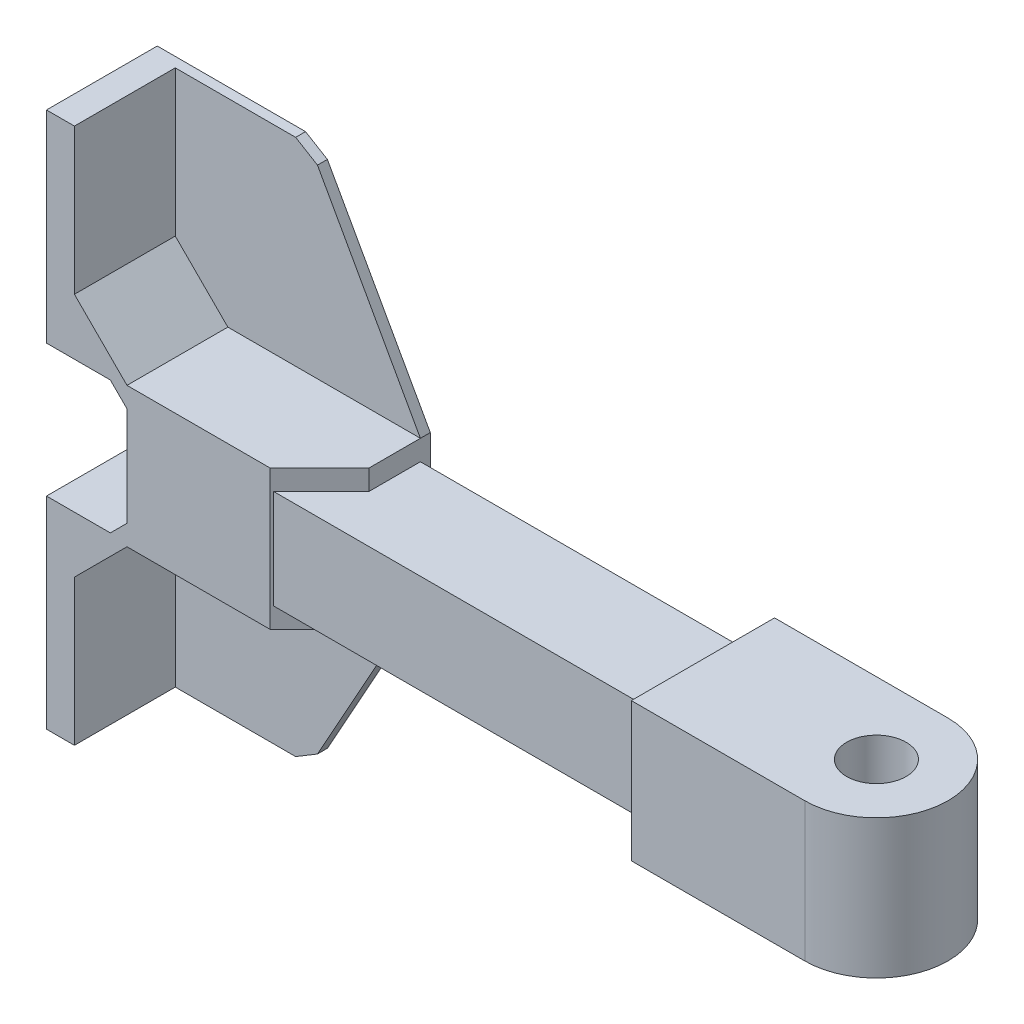
ISO-10303-21;
HEADER;
FILE_DESCRIPTION(('STEP AP214'),'2;1');
FILE_NAME('part.step','',(''),(''),'','','');
FILE_SCHEMA(('AUTOMOTIVE_DESIGN { 1 0 10303 214 1 1 1 1 }'));
ENDSEC;
DATA;
#1=APPLICATION_CONTEXT('core data for automotive mechanical design processes');
#2=APPLICATION_PROTOCOL_DEFINITION('international standard','automotive_design',2000,#1);
#3=PRODUCT_CONTEXT('',#1,'mechanical');
#4=PRODUCT('Part','Part','',(#3));
#5=PRODUCT_RELATED_PRODUCT_CATEGORY('part','',(#4));
#6=PRODUCT_DEFINITION_FORMATION('','',#4);
#7=PRODUCT_DEFINITION_CONTEXT('part definition',#1,'design');
#8=PRODUCT_DEFINITION('design','',#6,#7);
#9=PRODUCT_DEFINITION_SHAPE('','',#8);
#10=(LENGTH_UNIT() NAMED_UNIT(*) SI_UNIT(.MILLI.,.METRE.));
#11=(NAMED_UNIT(*) PLANE_ANGLE_UNIT() SI_UNIT($,.RADIAN.));
#12=(NAMED_UNIT(*) SI_UNIT($,.STERADIAN.) SOLID_ANGLE_UNIT());
#13=UNCERTAINTY_MEASURE_WITH_UNIT(LENGTH_MEASURE(1.E-05),#10,'distance_accuracy_value','');
#14=(GEOMETRIC_REPRESENTATION_CONTEXT(3) GLOBAL_UNCERTAINTY_ASSIGNED_CONTEXT((#13)) GLOBAL_UNIT_ASSIGNED_CONTEXT((#10,
#11,#12)) REPRESENTATION_CONTEXT('',''));
#15=CARTESIAN_POINT('',(0.,0.,0.));
#16=DIRECTION('',(0.,0.,1.));
#17=DIRECTION('',(1.,0.,0.));
#18=AXIS2_PLACEMENT_3D('',#15,#16,#17);
#19=CARTESIAN_POINT('',(15.93,0.,-2.));
#20=DIRECTION('',(1.,0.,0.));
#21=DIRECTION('',(0.,1.,0.));
#22=AXIS2_PLACEMENT_3D('',#19,#20,#21);
#23=PLANE('',#22);
#24=DIRECTION('',(0.,0.,1.));
#25=VECTOR('',#24,1.);
#26=CARTESIAN_POINT('',(15.93,-4.1,-63.6078254106593));
#27=LINE('',#26,#25);
#28=CARTESIAN_POINT('',(15.93,-4.1,0.));
#29=VERTEX_POINT('',#28);
#30=CARTESIAN_POINT('',(15.93,-4.1,10.35));
#31=VERTEX_POINT('',#30);
#32=EDGE_CURVE('E263',#29,#31,#27,.T.);
#33=ORIENTED_EDGE('',*,*,#32,.F.);
#34=DIRECTION('',(0.,0.,1.));
#35=VECTOR('',#34,1.);
#36=CARTESIAN_POINT('',(15.93,-4.1,-2.));
#37=LINE('',#36,#35);
#38=CARTESIAN_POINT('',(15.93,-4.1,-2.));
#39=VERTEX_POINT('',#38);
#40=EDGE_CURVE('E418',#39,#29,#37,.T.);
#41=ORIENTED_EDGE('',*,*,#40,.F.);
#42=DIRECTION('',(0.,1.,0.));
#43=VECTOR('',#42,1.);
#44=CARTESIAN_POINT('',(15.93,0.,-2.));
#45=LINE('',#44,#43);
#46=CARTESIAN_POINT('',(15.93,24.1,-2.));
#47=VERTEX_POINT('',#46);
#48=EDGE_CURVE('E394',#39,#47,#45,.T.);
#49=ORIENTED_EDGE('',*,*,#48,.T.);
#50=DIRECTION('',(0.,0.,1.));
#51=VECTOR('',#50,1.);
#52=CARTESIAN_POINT('',(15.93,24.1,-2.));
#53=LINE('',#52,#51);
#54=CARTESIAN_POINT('',(15.93,24.1,0.));
#55=VERTEX_POINT('',#54);
#56=EDGE_CURVE('E415',#47,#55,#53,.T.);
#57=ORIENTED_EDGE('',*,*,#56,.T.);
#58=DIRECTION('',(0.,0.,1.));
#59=VECTOR('',#58,1.);
#60=CARTESIAN_POINT('',(15.93,24.1,-63.6078254106593));
#61=LINE('',#60,#59);
#62=CARTESIAN_POINT('',(15.93,24.1,10.35));
#63=VERTEX_POINT('',#62);
#64=EDGE_CURVE('E300',#55,#63,#61,.T.);
#65=ORIENTED_EDGE('',*,*,#64,.T.);
#66=DIRECTION('',(0.,1.,0.));
#67=VECTOR('',#66,1.);
#68=CARTESIAN_POINT('',(15.93,-44.1,10.35));
#69=LINE('',#68,#67);
#70=CARTESIAN_POINT('',(15.93,20.,10.35));
#71=VERTEX_POINT('',#70);
#72=EDGE_CURVE('E361',#71,#63,#69,.T.);
#73=ORIENTED_EDGE('',*,*,#72,.F.);
#74=DIRECTION('',(0.,0.,1.));
#75=VECTOR('',#74,1.);
#76=CARTESIAN_POINT('',(15.93,20.,0.));
#77=LINE('',#76,#75);
#78=CARTESIAN_POINT('',(15.93,20.,0.));
#79=VERTEX_POINT('',#78);
#80=EDGE_CURVE('E367',#79,#71,#77,.T.);
#81=ORIENTED_EDGE('',*,*,#80,.F.);
#82=DIRECTION('',(0.,1.,0.));
#83=VECTOR('',#82,1.);
#84=CARTESIAN_POINT('',(15.93,0.,0.));
#85=LINE('',#84,#83);
#86=CARTESIAN_POINT('',(15.93,0.,0.));
#87=VERTEX_POINT('',#86);
#88=EDGE_CURVE('E406',#87,#79,#85,.T.);
#89=ORIENTED_EDGE('',*,*,#88,.F.);
#90=DIRECTION('',(0.,0.,1.));
#91=VECTOR('',#90,1.);
#92=CARTESIAN_POINT('',(15.93,0.,0.));
#93=LINE('',#92,#91);
#94=CARTESIAN_POINT('',(15.93,0.,10.35));
#95=VERTEX_POINT('',#94);
#96=EDGE_CURVE('E364',#87,#95,#93,.T.);
#97=ORIENTED_EDGE('',*,*,#96,.T.);
#98=EDGE_CURVE('E362',#31,#95,#69,.T.);
#99=ORIENTED_EDGE('',*,*,#98,.F.);
#100=EDGE_LOOP('',(#33,#41,#49,#57,#65,#73,#81,#89,#97,#99));
#101=FACE_BOUND('',#100,.T.);
#102=ADVANCED_FACE('F44',(#101),#23,.T.);
#103=CARTESIAN_POINT('',(-39.1599999999998,0.,-2.));
#104=DIRECTION('',(-1.,0.,0.));
#105=DIRECTION('',(0.,-1.,0.));
#106=AXIS2_PLACEMENT_3D('',#103,#104,#105);
#107=PLANE('',#106);
#108=DIRECTION('',(0.,1.,0.));
#109=VECTOR('',#108,1.);
#110=CARTESIAN_POINT('',(-39.1599999999998,-44.1,20.3484898859778));
#111=LINE('',#110,#109);
#112=CARTESIAN_POINT('',(-39.1599999999998,-44.1,20.3484898859778));
#113=VERTEX_POINT('',#112);
#114=CARTESIAN_POINT('',(-39.1599999999998,-3.35848988597784,20.3484898859778));
#115=VERTEX_POINT('',#114);
#116=EDGE_CURVE('E356',#113,#115,#111,.T.);
#117=ORIENTED_EDGE('',*,*,#116,.T.);
#118=DIRECTION('',(0.,0.,1.));
#119=VECTOR('',#118,1.);
#120=CARTESIAN_POINT('',(-39.1599999999998,-3.35848988597784,-63.6078254106593));
#121=LINE('',#120,#119);
#122=CARTESIAN_POINT('',(-39.1599999999998,-3.35848988597784,0.));
#123=VERTEX_POINT('',#122);
#124=EDGE_CURVE('E339',#123,#115,#121,.T.);
#125=ORIENTED_EDGE('',*,*,#124,.F.);
#126=DIRECTION('',(0.,1.,0.));
#127=VECTOR('',#126,1.);
#128=CARTESIAN_POINT('',(-39.1599999999998,0.,0.));
#129=LINE('',#128,#127);
#130=CARTESIAN_POINT('',(-39.1599999999998,23.3584898859779,0.));
#131=VERTEX_POINT('',#130);
#132=EDGE_CURVE('E310',#123,#131,#129,.T.);
#133=ORIENTED_EDGE('',*,*,#132,.T.);
#134=DIRECTION('',(0.,0.,1.));
#135=VECTOR('',#134,1.);
#136=CARTESIAN_POINT('',(-39.1599999999998,23.3584898859779,-63.6078254106593));
#137=LINE('',#136,#135);
#138=CARTESIAN_POINT('',(-39.1599999999998,23.3584898859779,20.3484898859778));
#139=VERTEX_POINT('',#138);
#140=EDGE_CURVE('E341',#131,#139,#137,.T.);
#141=ORIENTED_EDGE('',*,*,#140,.T.);
#142=CARTESIAN_POINT('',(-39.1599999999998,64.1,20.3484898859778));
#143=VERTEX_POINT('',#142);
#144=EDGE_CURVE('E353',#139,#143,#111,.T.);
#145=ORIENTED_EDGE('',*,*,#144,.T.);
#146=DIRECTION('',(0.,0.,1.));
#147=VECTOR('',#146,1.);
#148=CARTESIAN_POINT('',(-39.1599999999999,64.1,-2.));
#149=LINE('',#148,#147);
#150=CARTESIAN_POINT('',(-39.1599999999999,64.1,-2.));
#151=VERTEX_POINT('',#150);
#152=EDGE_CURVE('E430',#151,#143,#149,.T.);
#153=ORIENTED_EDGE('',*,*,#152,.F.);
#154=DIRECTION('',(0.,-1.,0.));
#155=VECTOR('',#154,1.);
#156=CARTESIAN_POINT('',(-39.1599999999998,0.,-2.));
#157=LINE('',#156,#155);
#158=CARTESIAN_POINT('',(-39.1599999999998,-44.1,-2.));
#159=VERTEX_POINT('',#158);
#160=EDGE_CURVE('E382',#151,#159,#157,.T.);
#161=ORIENTED_EDGE('',*,*,#160,.T.);
#162=DIRECTION('',(0.,0.,1.));
#163=VECTOR('',#162,1.);
#164=CARTESIAN_POINT('',(-39.1599999999998,-44.1,-2.));
#165=LINE('',#164,#163);
#166=EDGE_CURVE('E427',#159,#113,#165,.T.);
#167=ORIENTED_EDGE('',*,*,#166,.T.);
#168=EDGE_LOOP('',(#117,#125,#133,#141,#145,#153,#161,#167));
#169=FACE_BOUND('',#168,.T.);
#170=ADVANCED_FACE('F539',(#169),#107,.T.);
#171=CARTESIAN_POINT('',(0.,64.1,-2.));
#172=DIRECTION('',(0.,-1.,0.));
#173=DIRECTION('',(1.,0.,0.));
#174=AXIS2_PLACEMENT_3D('',#171,#172,#173);
#175=PLANE('',#174);
#176=DIRECTION('',(0.,0.,1.));
#177=VECTOR('',#176,1.);
#178=CARTESIAN_POINT('',(-33.5266017177982,64.1,-63.6078254106593));
#179=LINE('',#178,#177);
#180=CARTESIAN_POINT('',(-33.5266017177982,64.1,0.));
#181=VERTEX_POINT('',#180);
#182=CARTESIAN_POINT('',(-33.5266017177982,64.1,20.3484898859778));
#183=VERTEX_POINT('',#182);
#184=EDGE_CURVE('E304',#181,#183,#179,.T.);
#185=ORIENTED_EDGE('',*,*,#184,.F.);
#186=DIRECTION('',(-1.,0.,0.));
#187=VECTOR('',#186,1.);
#188=CARTESIAN_POINT('',(0.,64.1,0.));
#189=LINE('',#188,#187);
#190=CARTESIAN_POINT('',(-9.23999999999984,64.1,0.));
#191=VERTEX_POINT('',#190);
#192=EDGE_CURVE('E285',#191,#181,#189,.T.);
#193=ORIENTED_EDGE('',*,*,#192,.F.);
#194=DIRECTION('',(0.,0.,1.));
#195=VECTOR('',#194,1.);
#196=CARTESIAN_POINT('',(-9.23999999999985,64.1,-2.));
#197=LINE('',#196,#195);
#198=CARTESIAN_POINT('',(-9.23999999999985,64.1,-2.));
#199=VERTEX_POINT('',#198);
#200=EDGE_CURVE('E399',#199,#191,#197,.T.);
#201=ORIENTED_EDGE('',*,*,#200,.F.);
#202=DIRECTION('',(1.,0.,0.));
#203=VECTOR('',#202,1.);
#204=CARTESIAN_POINT('',(0.,64.1,-2.));
#205=LINE('',#204,#203);
#206=EDGE_CURVE('E379',#151,#199,#205,.T.);
#207=ORIENTED_EDGE('',*,*,#206,.F.);
#208=ORIENTED_EDGE('',*,*,#152,.T.);
#209=DIRECTION('',(-1.,0.,0.));
#210=VECTOR('',#209,1.);
#211=CARTESIAN_POINT('',(-26.2784898859778,64.1,20.3484898859778));
#212=LINE('',#211,#210);
#213=EDGE_CURVE('E350',#183,#143,#212,.T.);
#214=ORIENTED_EDGE('',*,*,#213,.F.);
#215=EDGE_LOOP('',(#185,#193,#201,#207,#208,#214));
#216=FACE_BOUND('',#215,.T.);
#217=ADVANCED_FACE('F545',(#216),#175,.F.);
#218=CARTESIAN_POINT('',(15.93,-44.1,10.35));
#219=DIRECTION('',(-0.707106781186546,0.,-0.707106781186549));
#220=DIRECTION('',(-0.707106781186549,0.,0.707106781186546));
#221=AXIS2_PLACEMENT_3D('',#218,#219,#220);
#222=PLANE('',#221);
#223=DIRECTION('',(0.,1.,0.));
#224=VECTOR('',#223,1.);
#225=CARTESIAN_POINT('',(5.93151011402221,-44.1,20.3484898859778));
#226=LINE('',#225,#224);
#227=CARTESIAN_POINT('',(5.93151011402221,-4.1,20.3484898859778));
#228=VERTEX_POINT('',#227);
#229=CARTESIAN_POINT('',(5.93151011402221,24.1,20.3484898859778));
#230=VERTEX_POINT('',#229);
#231=EDGE_CURVE('E359',#228,#230,#226,.T.);
#232=ORIENTED_EDGE('',*,*,#231,.F.);
#233=DIRECTION('',(0.707106781186549,0.,-0.707106781186546));
#234=VECTOR('',#233,1.);
#235=CARTESIAN_POINT('',(15.93,-4.10000000000001,10.35));
#236=LINE('',#235,#234);
#237=EDGE_CURVE('E67',#228,#31,#236,.T.);
#238=ORIENTED_EDGE('',*,*,#237,.T.);
#239=ORIENTED_EDGE('',*,*,#98,.T.);
#240=DIRECTION('',(-0.707106781186549,0.,0.707106781186546));
#241=VECTOR('',#240,1.);
#242=CARTESIAN_POINT('',(13.14,0.,13.14));
#243=LINE('',#242,#241);
#244=CARTESIAN_POINT('',(6.27999999999993,0.,20.));
#245=VERTEX_POINT('',#244);
#246=EDGE_CURVE('E490',#95,#245,#243,.T.);
#247=ORIENTED_EDGE('',*,*,#246,.T.);
#248=DIRECTION('',(0.,1.,0.));
#249=VECTOR('',#248,1.);
#250=CARTESIAN_POINT('',(6.27999999999997,20.,20.));
#251=LINE('',#250,#249);
#252=CARTESIAN_POINT('',(6.27999999999997,20.,20.));
#253=VERTEX_POINT('',#252);
#254=EDGE_CURVE('E370',#245,#253,#251,.T.);
#255=ORIENTED_EDGE('',*,*,#254,.T.);
#256=DIRECTION('',(-0.707106781186549,0.,0.707106781186546));
#257=VECTOR('',#256,1.);
#258=CARTESIAN_POINT('',(13.14,20.,13.14));
#259=LINE('',#258,#257);
#260=EDGE_CURVE('E372',#71,#253,#259,.T.);
#261=ORIENTED_EDGE('',*,*,#260,.F.);
#262=ORIENTED_EDGE('',*,*,#72,.T.);
#263=DIRECTION('',(0.707106781186549,0.,-0.707106781186546));
#264=VECTOR('',#263,1.);
#265=CARTESIAN_POINT('',(15.93,24.1,10.35));
#266=LINE('',#265,#264);
#267=EDGE_CURVE('E284',#230,#63,#266,.T.);
#268=ORIENTED_EDGE('',*,*,#267,.F.);
#269=EDGE_LOOP('',(#232,#238,#239,#247,#255,#261,#262,#268));
#270=FACE_BOUND('',#269,.T.);
#271=ADVANCED_FACE('F500',(#270),#222,.F.);
#272=CARTESIAN_POINT('',(-26.2784898859778,-44.1,20.3484898859778));
#273=DIRECTION('',(0.,0.,-1.));
#274=DIRECTION('',(-1.,0.,0.));
#275=AXIS2_PLACEMENT_3D('',#272,#273,#274);
#276=PLANE('',#275);
#277=DIRECTION('',(-1.,0.,0.));
#278=VECTOR('',#277,1.);
#279=CARTESIAN_POINT('',(-26.2784898859778,-44.1,20.3484898859778));
#280=LINE('',#279,#278);
#281=CARTESIAN_POINT('',(-33.5266017177982,-44.1,20.3484898859778));
#282=VERTEX_POINT('',#281);
#283=EDGE_CURVE('E351',#282,#113,#280,.T.);
#284=ORIENTED_EDGE('',*,*,#283,.F.);
#285=DIRECTION('',(0.,-1.,0.));
#286=VECTOR('',#285,1.);
#287=CARTESIAN_POINT('',(-33.5266017177982,0.,20.3484898859778));
#288=LINE('',#287,#286);
#289=CARTESIAN_POINT('',(-33.5266017177982,-14.7066017177982,20.3484898859778));
#290=VERTEX_POINT('',#289);
#291=EDGE_CURVE('E267',#290,#282,#288,.T.);
#292=ORIENTED_EDGE('',*,*,#291,.F.);
#293=DIRECTION('',(-0.707106781186547,-0.707106781186548,0.));
#294=VECTOR('',#293,1.);
#295=CARTESIAN_POINT('',(-9.41000000000001,9.41,20.3484898859778));
#296=LINE('',#295,#294);
#297=CARTESIAN_POINT('',(-22.92,-4.1,20.3484898859778));
#298=VERTEX_POINT('',#297);
#299=EDGE_CURVE('E258',#298,#290,#296,.T.);
#300=ORIENTED_EDGE('',*,*,#299,.F.);
#301=DIRECTION('',(1.,0.,0.));
#302=VECTOR('',#301,1.);
#303=CARTESIAN_POINT('',(-26.2784898859778,-4.1,20.3484898859778));
#304=LINE('',#303,#302);
#305=EDGE_CURVE('E11',#298,#228,#304,.T.);
#306=ORIENTED_EDGE('',*,*,#305,.T.);
#307=ORIENTED_EDGE('',*,*,#231,.T.);
#308=DIRECTION('',(1.,0.,0.));
#309=VECTOR('',#308,1.);
#310=CARTESIAN_POINT('',(-26.2784898859778,24.1,20.3484898859778));
#311=LINE('',#310,#309);
#312=CARTESIAN_POINT('',(-22.92,24.1,20.3484898859778));
#313=VERTEX_POINT('',#312);
#314=EDGE_CURVE('E52',#313,#230,#311,.T.);
#315=ORIENTED_EDGE('',*,*,#314,.F.);
#316=DIRECTION('',(-0.707106781186547,0.707106781186548,0.));
#317=VECTOR('',#316,1.);
#318=CARTESIAN_POINT('',(0.589999999999988,0.589999999999987,20.3484898859778));
#319=LINE('',#318,#317);
#320=CARTESIAN_POINT('',(-33.5266017177982,34.7066017177982,20.3484898859778));
#321=VERTEX_POINT('',#320);
#322=EDGE_CURVE('E296',#313,#321,#319,.T.);
#323=ORIENTED_EDGE('',*,*,#322,.T.);
#324=DIRECTION('',(0.,1.,0.));
#325=VECTOR('',#324,1.);
#326=CARTESIAN_POINT('',(-33.5266017177982,0.,20.3484898859778));
#327=LINE('',#326,#325);
#328=EDGE_CURVE('E293',#321,#183,#327,.T.);
#329=ORIENTED_EDGE('',*,*,#328,.T.);
#330=ORIENTED_EDGE('',*,*,#213,.T.);
#331=ORIENTED_EDGE('',*,*,#144,.F.);
#332=DIRECTION('',(-1.,0.,0.));
#333=VECTOR('',#332,1.);
#334=CARTESIAN_POINT('',(1.25825374229887E-13,23.3584898859777,20.3484898859778));
#335=LINE('',#334,#333);
#336=CARTESIAN_POINT('',(-26.2784898859778,23.3584898859779,20.3484898859778));
#337=VERTEX_POINT('',#336);
#338=EDGE_CURVE('E327',#337,#139,#335,.T.);
#339=ORIENTED_EDGE('',*,*,#338,.F.);
#340=DIRECTION('',(-0.707106781186549,0.707106781186546,0.));
#341=VECTOR('',#340,1.);
#342=CARTESIAN_POINT('',(-1.45999999999993,-1.45999999999994,20.3484898859778));
#343=LINE('',#342,#341);
#344=CARTESIAN_POINT('',(-22.92,20.,20.3484898859778));
#345=VERTEX_POINT('',#344);
#346=EDGE_CURVE('E324',#345,#337,#343,.T.);
#347=ORIENTED_EDGE('',*,*,#346,.F.);
#348=DIRECTION('',(0.,-1.,0.));
#349=VECTOR('',#348,1.);
#350=CARTESIAN_POINT('',(-22.92,0.,20.3484898859778));
#351=LINE('',#350,#349);
#352=CARTESIAN_POINT('',(-22.92,0.,20.3484898859778));
#353=VERTEX_POINT('',#352);
#354=EDGE_CURVE('E59',#345,#353,#351,.T.);
#355=ORIENTED_EDGE('',*,*,#354,.T.);
#356=DIRECTION('',(-0.707106781186549,-0.707106781186546,0.));
#357=VECTOR('',#356,1.);
#358=CARTESIAN_POINT('',(-11.4599999999999,11.46,20.3484898859778));
#359=LINE('',#358,#357);
#360=CARTESIAN_POINT('',(-26.2784898859778,-3.35848988597786,20.3484898859778));
#361=VERTEX_POINT('',#360);
#362=EDGE_CURVE('E332',#353,#361,#359,.T.);
#363=ORIENTED_EDGE('',*,*,#362,.T.);
#364=DIRECTION('',(-1.,0.,0.));
#365=VECTOR('',#364,1.);
#366=CARTESIAN_POINT('',(0.,-3.35848988597794,20.3484898859778));
#367=LINE('',#366,#365);
#368=EDGE_CURVE('E329',#361,#115,#367,.T.);
#369=ORIENTED_EDGE('',*,*,#368,.T.);
#370=ORIENTED_EDGE('',*,*,#116,.F.);
#371=EDGE_LOOP('',(#284,#292,#300,#306,#307,#315,#323,#329,#330,#331,#339,#347,#355,#363,#369,#370));
#372=FACE_BOUND('',#371,.T.);
#373=ADVANCED_FACE('F266',(#372),#276,.F.);
#374=CARTESIAN_POINT('',(5.93000000000004,20.,20.));
#375=DIRECTION('',(0.,0.,-1.));
#376=DIRECTION('',(-1.,0.,0.));
#377=AXIS2_PLACEMENT_3D('',#374,#375,#376);
#378=PLANE('',#377);
#379=ORIENTED_EDGE('',*,*,#254,.F.);
#380=DIRECTION('',(1.,0.,0.));
#381=VECTOR('',#380,1.);
#382=CARTESIAN_POINT('',(5.93000000000004,0.,20.));
#383=LINE('',#382,#381);
#384=CARTESIAN_POINT('',(82.93,0.,20.));
#385=VERTEX_POINT('',#384);
#386=EDGE_CURVE('E414',#245,#385,#383,.T.);
#387=ORIENTED_EDGE('',*,*,#386,.T.);
#388=DIRECTION('',(0.,-1.,0.));
#389=VECTOR('',#388,1.);
#390=CARTESIAN_POINT('',(82.93,20.,20.));
#391=LINE('',#390,#389);
#392=CARTESIAN_POINT('',(82.93,20.,20.));
#393=VERTEX_POINT('',#392);
#394=EDGE_CURVE('E451',#393,#385,#391,.T.);
#395=ORIENTED_EDGE('',*,*,#394,.F.);
#396=DIRECTION('',(1.,0.,0.));
#397=VECTOR('',#396,1.);
#398=CARTESIAN_POINT('',(5.93000000000004,20.,20.));
#399=LINE('',#398,#397);
#400=EDGE_CURVE('E435',#253,#393,#399,.T.);
#401=ORIENTED_EDGE('',*,*,#400,.F.);
#402=EDGE_LOOP('',(#379,#387,#395,#401));
#403=FACE_BOUND('',#402,.T.);
#404=ADVANCED_FACE('F526',(#403),#378,.F.);
#405=CARTESIAN_POINT('',(0.,20.,0.));
#406=DIRECTION('',(0.,1.,0.));
#407=DIRECTION('',(0.,0.,1.));
#408=AXIS2_PLACEMENT_3D('',#405,#406,#407);
#409=PLANE('',#408);
#410=DIRECTION('',(-1.,0.,0.));
#411=VECTOR('',#410,1.);
#412=CARTESIAN_POINT('',(5.93000000000003,20.,0.));
#413=LINE('',#412,#411);
#414=CARTESIAN_POINT('',(82.93,20.,0.));
#415=VERTEX_POINT('',#414);
#416=EDGE_CURVE('E440',#415,#79,#413,.T.);
#417=ORIENTED_EDGE('',*,*,#416,.T.);
#418=ORIENTED_EDGE('',*,*,#80,.T.);
#419=ORIENTED_EDGE('',*,*,#260,.T.);
#420=ORIENTED_EDGE('',*,*,#400,.T.);
#421=DIRECTION('',(0.,0.,-1.));
#422=VECTOR('',#421,1.);
#423=CARTESIAN_POINT('',(82.93,20.,0.));
#424=LINE('',#423,#422);
#425=EDGE_CURVE('E437',#393,#415,#424,.T.);
#426=ORIENTED_EDGE('',*,*,#425,.T.);
#427=EDGE_LOOP('',(#417,#418,#419,#420,#426));
#428=FACE_BOUND('',#427,.T.);
#429=ADVANCED_FACE('F506',(#428),#409,.T.);
#430=CARTESIAN_POINT('',(0.,0.,0.));
#431=DIRECTION('',(0.,1.,0.));
#432=DIRECTION('',(0.,0.,1.));
#433=AXIS2_PLACEMENT_3D('',#430,#431,#432);
#434=PLANE('',#433);
#435=ORIENTED_EDGE('',*,*,#96,.F.);
#436=DIRECTION('',(-1.,0.,0.));
#437=VECTOR('',#436,1.);
#438=CARTESIAN_POINT('',(5.93000000000003,0.,0.));
#439=LINE('',#438,#437);
#440=CARTESIAN_POINT('',(82.93,0.,0.));
#441=VERTEX_POINT('',#440);
#442=EDGE_CURVE('E438',#441,#87,#439,.T.);
#443=ORIENTED_EDGE('',*,*,#442,.F.);
#444=DIRECTION('',(0.,0.,-1.));
#445=VECTOR('',#444,1.);
#446=CARTESIAN_POINT('',(82.93,0.,0.));
#447=LINE('',#446,#445);
#448=EDGE_CURVE('E445',#385,#441,#447,.T.);
#449=ORIENTED_EDGE('',*,*,#448,.F.);
#450=ORIENTED_EDGE('',*,*,#386,.F.);
#451=ORIENTED_EDGE('',*,*,#246,.F.);
#452=EDGE_LOOP('',(#435,#443,#449,#450,#451));
#453=FACE_BOUND('',#452,.T.);
#454=ADVANCED_FACE('F521',(#453),#434,.F.);
#455=CARTESIAN_POINT('',(117.93,24.,10.));
#456=DIRECTION('',(0.,-1.,0.));
#457=DIRECTION('',(0.,0.,-1.));
#458=AXIS2_PLACEMENT_3D('',#455,#456,#457);
#459=CYLINDRICAL_SURFACE('',#458,14.45);
#460=CARTESIAN_POINT('',(117.93,-4.,10.));
#461=DIRECTION('',(0.,1.,0.));
#462=DIRECTION('',(0.,0.,1.));
#463=AXIS2_PLACEMENT_3D('',#460,#461,#462);
#464=CIRCLE('',#463,14.45);
#465=CARTESIAN_POINT('',(117.93,-4.,24.45));
#466=VERTEX_POINT('',#465);
#467=CARTESIAN_POINT('',(117.93,-4.,-4.45));
#468=VERTEX_POINT('',#467);
#469=EDGE_CURVE('E458',#466,#468,#464,.T.);
#470=ORIENTED_EDGE('',*,*,#469,.T.);
#471=DIRECTION('',(0.,-1.,0.));
#472=VECTOR('',#471,1.);
#473=CARTESIAN_POINT('',(117.93,24.,-4.45));
#474=LINE('',#473,#472);
#475=CARTESIAN_POINT('',(117.93,24.,-4.45));
#476=VERTEX_POINT('',#475);
#477=EDGE_CURVE('E487',#476,#468,#474,.T.);
#478=ORIENTED_EDGE('',*,*,#477,.F.);
#479=CARTESIAN_POINT('',(117.93,24.,10.));
#480=DIRECTION('',(0.,1.,0.));
#481=DIRECTION('',(0.,0.,1.));
#482=AXIS2_PLACEMENT_3D('',#479,#480,#481);
#483=CIRCLE('',#482,14.45);
#484=CARTESIAN_POINT('',(117.93,24.,24.45));
#485=VERTEX_POINT('',#484);
#486=EDGE_CURVE('E461',#485,#476,#483,.T.);
#487=ORIENTED_EDGE('',*,*,#486,.F.);
#488=DIRECTION('',(0.,-1.,0.));
#489=VECTOR('',#488,1.);
#490=CARTESIAN_POINT('',(117.93,24.,24.45));
#491=LINE('',#490,#489);
#492=EDGE_CURVE('E471',#485,#466,#491,.T.);
#493=ORIENTED_EDGE('',*,*,#492,.T.);
#494=EDGE_LOOP('',(#470,#478,#487,#493));
#495=FACE_BOUND('',#494,.T.);
#496=ADVANCED_FACE('F46',(#495),#459,.T.);
#497=CARTESIAN_POINT('',(117.93,24.,-4.45));
#498=DIRECTION('',(0.,0.,1.));
#499=DIRECTION('',(1.,0.,0.));
#500=AXIS2_PLACEMENT_3D('',#497,#498,#499);
#501=PLANE('',#500);
#502=DIRECTION('',(-1.,0.,0.));
#503=VECTOR('',#502,1.);
#504=CARTESIAN_POINT('',(117.93,-4.,-4.45));
#505=LINE('',#504,#503);
#506=CARTESIAN_POINT('',(82.93,-4.,-4.45000000000002));
#507=VERTEX_POINT('',#506);
#508=EDGE_CURVE('E474',#468,#507,#505,.T.);
#509=ORIENTED_EDGE('',*,*,#508,.T.);
#510=DIRECTION('',(0.,-1.,0.));
#511=VECTOR('',#510,1.);
#512=CARTESIAN_POINT('',(82.93,24.,-4.45000000000002));
#513=LINE('',#512,#511);
#514=CARTESIAN_POINT('',(82.93,24.,-4.45000000000002));
#515=VERTEX_POINT('',#514);
#516=EDGE_CURVE('E484',#515,#507,#513,.T.);
#517=ORIENTED_EDGE('',*,*,#516,.F.);
#518=DIRECTION('',(-1.,0.,0.));
#519=VECTOR('',#518,1.);
#520=CARTESIAN_POINT('',(117.93,24.,-4.45));
#521=LINE('',#520,#519);
#522=EDGE_CURVE('E464',#476,#515,#521,.T.);
#523=ORIENTED_EDGE('',*,*,#522,.F.);
#524=ORIENTED_EDGE('',*,*,#477,.T.);
#525=EDGE_LOOP('',(#509,#517,#523,#524));
#526=FACE_BOUND('',#525,.T.);
#527=ADVANCED_FACE('F596',(#526),#501,.F.);
#528=CARTESIAN_POINT('',(82.93,24.,-4.45000000000002));
#529=DIRECTION('',(1.,0.,0.));
#530=DIRECTION('',(0.,0.,-1.));
#531=AXIS2_PLACEMENT_3D('',#528,#529,#530);
#532=PLANE('',#531);
#533=ORIENTED_EDGE('',*,*,#394,.T.);
#534=ORIENTED_EDGE('',*,*,#448,.T.);
#535=DIRECTION('',(0.,-1.,0.));
#536=VECTOR('',#535,1.);
#537=CARTESIAN_POINT('',(82.93,20.,0.));
#538=LINE('',#537,#536);
#539=EDGE_CURVE('E443',#415,#441,#538,.T.);
#540=ORIENTED_EDGE('',*,*,#539,.F.);
#541=ORIENTED_EDGE('',*,*,#425,.F.);
#542=EDGE_LOOP('',(#533,#534,#540,#541));
#543=FACE_BOUND('',#542,.T.);
#544=DIRECTION('',(0.,0.,1.));
#545=VECTOR('',#544,1.);
#546=CARTESIAN_POINT('',(82.93,-4.,-4.45000000000002));
#547=LINE('',#546,#545);
#548=CARTESIAN_POINT('',(82.93,-4.,24.45));
#549=VERTEX_POINT('',#548);
#550=EDGE_CURVE('E476',#507,#549,#547,.T.);
#551=ORIENTED_EDGE('',*,*,#550,.T.);
#552=DIRECTION('',(0.,-1.,0.));
#553=VECTOR('',#552,1.);
#554=CARTESIAN_POINT('',(82.93,24.,24.45));
#555=LINE('',#554,#553);
#556=CARTESIAN_POINT('',(82.93,24.,24.45));
#557=VERTEX_POINT('',#556);
#558=EDGE_CURVE('E481',#557,#549,#555,.T.);
#559=ORIENTED_EDGE('',*,*,#558,.F.);
#560=DIRECTION('',(0.,0.,1.));
#561=VECTOR('',#560,1.);
#562=CARTESIAN_POINT('',(82.93,24.,-4.45000000000002));
#563=LINE('',#562,#561);
#564=EDGE_CURVE('E467',#515,#557,#563,.T.);
#565=ORIENTED_EDGE('',*,*,#564,.F.);
#566=ORIENTED_EDGE('',*,*,#516,.T.);
#567=EDGE_LOOP('',(#551,#559,#565,#566));
#568=FACE_BOUND('',#567,.T.);
#569=ADVANCED_FACE('F515',(#543,#568),#532,.F.);
#570=CARTESIAN_POINT('',(82.93,24.,24.45));
#571=DIRECTION('',(0.,0.,-1.));
#572=DIRECTION('',(-1.,0.,0.));
#573=AXIS2_PLACEMENT_3D('',#570,#571,#572);
#574=PLANE('',#573);
#575=DIRECTION('',(1.,0.,0.));
#576=VECTOR('',#575,1.);
#577=CARTESIAN_POINT('',(82.93,-4.,24.45));
#578=LINE('',#577,#576);
#579=EDGE_CURVE('E465',#549,#466,#578,.T.);
#580=ORIENTED_EDGE('',*,*,#579,.T.);
#581=ORIENTED_EDGE('',*,*,#492,.F.);
#582=DIRECTION('',(1.,0.,0.));
#583=VECTOR('',#582,1.);
#584=CARTESIAN_POINT('',(82.93,24.,24.45));
#585=LINE('',#584,#583);
#586=EDGE_CURVE('E469',#557,#485,#585,.T.);
#587=ORIENTED_EDGE('',*,*,#586,.F.);
#588=ORIENTED_EDGE('',*,*,#558,.T.);
#589=EDGE_LOOP('',(#580,#581,#587,#588));
#590=FACE_BOUND('',#589,.T.);
#591=ADVANCED_FACE('F590',(#590),#574,.F.);
#592=CARTESIAN_POINT('',(117.93,24.,10.));
#593=DIRECTION('',(0.,1.,0.));
#594=DIRECTION('',(0.,0.,1.));
#595=AXIS2_PLACEMENT_3D('',#592,#593,#594);
#596=PLANE('',#595);
#597=CARTESIAN_POINT('',(117.93,24.,10.));
#598=DIRECTION('',(0.,1.,0.));
#599=DIRECTION('',(0.,0.,1.));
#600=AXIS2_PLACEMENT_3D('',#597,#598,#599);
#601=CIRCLE('',#600,6.00000000000002);
#602=CARTESIAN_POINT('',(117.93,24.,16.));
#603=VERTEX_POINT('',#602);
#604=EDGE_CURVE('E454',#603,#603,#601,.T.);
#605=ORIENTED_EDGE('',*,*,#604,.F.);
#606=EDGE_LOOP('',(#605));
#607=FACE_BOUND('',#606,.T.);
#608=ORIENTED_EDGE('',*,*,#486,.T.);
#609=ORIENTED_EDGE('',*,*,#522,.T.);
#610=ORIENTED_EDGE('',*,*,#564,.T.);
#611=ORIENTED_EDGE('',*,*,#586,.T.);
#612=EDGE_LOOP('',(#608,#609,#610,#611));
#613=FACE_BOUND('',#612,.T.);
#614=ADVANCED_FACE('F583',(#607,#613),#596,.T.);
#615=CARTESIAN_POINT('',(117.93,-4.,10.));
#616=DIRECTION('',(0.,1.,0.));
#617=DIRECTION('',(0.,0.,1.));
#618=AXIS2_PLACEMENT_3D('',#615,#616,#617);
#619=PLANE('',#618);
#620=CARTESIAN_POINT('',(117.93,-4.,10.));
#621=DIRECTION('',(0.,1.,0.));
#622=DIRECTION('',(0.,0.,1.));
#623=AXIS2_PLACEMENT_3D('',#620,#621,#622);
#624=CIRCLE('',#623,6.00000000000002);
#625=CARTESIAN_POINT('',(117.93,-4.,16.));
#626=VERTEX_POINT('',#625);
#627=EDGE_CURVE('E455',#626,#626,#624,.T.);
#628=ORIENTED_EDGE('',*,*,#627,.T.);
#629=EDGE_LOOP('',(#628));
#630=FACE_BOUND('',#629,.T.);
#631=ORIENTED_EDGE('',*,*,#469,.F.);
#632=ORIENTED_EDGE('',*,*,#579,.F.);
#633=ORIENTED_EDGE('',*,*,#550,.F.);
#634=ORIENTED_EDGE('',*,*,#508,.F.);
#635=EDGE_LOOP('',(#631,#632,#633,#634));
#636=FACE_BOUND('',#635,.T.);
#637=ADVANCED_FACE('F577',(#630,#636),#619,.F.);
#638=CARTESIAN_POINT('',(117.93,-4.,10.));
#639=DIRECTION('',(0.,1.,0.));
#640=DIRECTION('',(0.,0.,1.));
#641=AXIS2_PLACEMENT_3D('',#638,#639,#640);
#642=CYLINDRICAL_SURFACE('',#641,6.00000000000002);
#643=ORIENTED_EDGE('',*,*,#627,.F.);
#644=EDGE_LOOP('',(#643));
#645=FACE_BOUND('',#644,.T.);
#646=ORIENTED_EDGE('',*,*,#604,.T.);
#647=EDGE_LOOP('',(#646));
#648=FACE_BOUND('',#647,.T.);
#649=ADVANCED_FACE('F573',(#645,#648),#642,.F.);
#650=CARTESIAN_POINT('',(5.93000000000003,20.,0.));
#651=DIRECTION('',(0.,0.,1.));
#652=DIRECTION('',(1.,0.,0.));
#653=AXIS2_PLACEMENT_3D('',#650,#651,#652);
#654=PLANE('',#653);
#655=ORIENTED_EDGE('',*,*,#442,.T.);
#656=ORIENTED_EDGE('',*,*,#88,.T.);
#657=ORIENTED_EDGE('',*,*,#416,.F.);
#658=ORIENTED_EDGE('',*,*,#539,.T.);
#659=EDGE_LOOP('',(#655,#656,#657,#658));
#660=FACE_BOUND('',#659,.T.);
#661=ADVANCED_FACE('F512',(#660),#654,.F.);
#662=CARTESIAN_POINT('',(25.8703320870197,42.9535108668384,-2.));
#663=DIRECTION('',(-0.515935415843062,-0.856627484195346,0.));
#664=DIRECTION('',(0.856627484195346,-0.515935415843062,0.));
#665=AXIS2_PLACEMENT_3D('',#662,#663,#664);
#666=PLANE('',#665);
#667=DIRECTION('',(0.856627484195346,-0.515935415843062,0.));
#668=VECTOR('',#667,1.);
#669=CARTESIAN_POINT('',(25.8703320870197,42.9535108668384,0.));
#670=LINE('',#669,#668);
#671=CARTESIAN_POINT('',(-4.83693473123577,61.4480919625667,0.));
#672=VERTEX_POINT('',#671);
#673=EDGE_CURVE('E375',#191,#672,#670,.T.);
#674=ORIENTED_EDGE('',*,*,#673,.T.);
#675=DIRECTION('',(0.,0.,1.));
#676=VECTOR('',#675,1.);
#677=CARTESIAN_POINT('',(-4.83693473123577,61.4480919625667,-2.));
#678=LINE('',#677,#676);
#679=CARTESIAN_POINT('',(-4.83693473123577,61.4480919625667,-2.));
#680=VERTEX_POINT('',#679);
#681=EDGE_CURVE('E411',#680,#672,#678,.T.);
#682=ORIENTED_EDGE('',*,*,#681,.F.);
#683=DIRECTION('',(0.856627484195346,-0.515935415843062,0.));
#684=VECTOR('',#683,1.);
#685=CARTESIAN_POINT('',(25.8703320870197,42.9535108668384,-2.));
#686=LINE('',#685,#684);
#687=EDGE_CURVE('E376',#199,#680,#686,.T.);
#688=ORIENTED_EDGE('',*,*,#687,.F.);
#689=ORIENTED_EDGE('',*,*,#200,.T.);
#690=EDGE_LOOP('',(#674,#682,#688,#689));
#691=FACE_BOUND('',#690,.T.);
#692=ADVANCED_FACE('F568',(#691),#666,.F.);
#693=CARTESIAN_POINT('',(22.4037606403938,12.4573280857187,-2.));
#694=DIRECTION('',(-0.873978450940095,-0.485964677000656,0.));
#695=DIRECTION('',(0.485964677000656,-0.873978450940095,0.));
#696=AXIS2_PLACEMENT_3D('',#693,#694,#695);
#697=PLANE('',#696);
#698=DIRECTION('',(0.485964677000656,-0.873978450940095,0.));
#699=VECTOR('',#698,1.);
#700=CARTESIAN_POINT('',(22.4037606403938,12.4573280857187,0.));
#701=LINE('',#700,#699);
#702=EDGE_CURVE('E380',#672,#55,#701,.T.);
#703=ORIENTED_EDGE('',*,*,#702,.T.);
#704=ORIENTED_EDGE('',*,*,#56,.F.);
#705=DIRECTION('',(0.485964677000656,-0.873978450940095,0.));
#706=VECTOR('',#705,1.);
#707=CARTESIAN_POINT('',(22.4037606403938,12.4573280857187,-2.));
#708=LINE('',#707,#706);
#709=EDGE_CURVE('E397',#680,#47,#708,.T.);
#710=ORIENTED_EDGE('',*,*,#709,.F.);
#711=ORIENTED_EDGE('',*,*,#681,.T.);
#712=EDGE_LOOP('',(#703,#704,#710,#711));
#713=FACE_BOUND('',#712,.T.);
#714=ADVANCED_FACE('F550',(#713),#697,.F.);
#715=CARTESIAN_POINT('',(13.9093075280611,-7.73409473987167,-2.));
#716=DIRECTION('',(0.873978450940095,-0.485964677000656,0.));
#717=DIRECTION('',(0.485964677000656,0.873978450940095,0.));
#718=AXIS2_PLACEMENT_3D('',#715,#716,#717);
#719=PLANE('',#718);
#720=DIRECTION('',(0.485964677000656,0.873978450940095,0.));
#721=VECTOR('',#720,1.);
#722=CARTESIAN_POINT('',(13.9093075280611,-7.73409473987167,0.));
#723=LINE('',#722,#721);
#724=CARTESIAN_POINT('',(-4.83693473123576,-41.4480919625667,0.));
#725=VERTEX_POINT('',#724);
#726=EDGE_CURVE('E404',#725,#29,#723,.T.);
#727=ORIENTED_EDGE('',*,*,#726,.F.);
#728=DIRECTION('',(0.,0.,1.));
#729=VECTOR('',#728,1.);
#730=CARTESIAN_POINT('',(-4.83693473123576,-41.4480919625667,-2.));
#731=LINE('',#730,#729);
#732=CARTESIAN_POINT('',(-4.83693473123576,-41.4480919625667,-2.));
#733=VERTEX_POINT('',#732);
#734=EDGE_CURVE('E421',#733,#725,#731,.T.);
#735=ORIENTED_EDGE('',*,*,#734,.F.);
#736=DIRECTION('',(0.485964677000656,0.873978450940095,0.));
#737=VECTOR('',#736,1.);
#738=CARTESIAN_POINT('',(13.9093075280611,-7.73409473987167,-2.));
#739=LINE('',#738,#737);
#740=EDGE_CURVE('E391',#733,#39,#739,.T.);
#741=ORIENTED_EDGE('',*,*,#740,.T.);
#742=ORIENTED_EDGE('',*,*,#40,.T.);
#743=EDGE_LOOP('',(#727,#735,#741,#742));
#744=FACE_BOUND('',#743,.T.);
#745=ADVANCED_FACE('F552',(#744),#719,.T.);
#746=CARTESIAN_POINT('',(17.0310429414012,-28.2772979332616,-2.));
#747=DIRECTION('',(0.51593541584306,-0.856627484195347,0.));
#748=DIRECTION('',(0.856627484195347,0.51593541584306,0.));
#749=AXIS2_PLACEMENT_3D('',#746,#747,#748);
#750=PLANE('',#749);
#751=DIRECTION('',(0.856627484195347,0.51593541584306,0.));
#752=VECTOR('',#751,1.);
#753=CARTESIAN_POINT('',(17.0310429414012,-28.2772979332616,0.));
#754=LINE('',#753,#752);
#755=CARTESIAN_POINT('',(-9.23999999999984,-44.1,0.));
#756=VERTEX_POINT('',#755);
#757=EDGE_CURVE('E402',#756,#725,#754,.T.);
#758=ORIENTED_EDGE('',*,*,#757,.F.);
#759=DIRECTION('',(0.,0.,1.));
#760=VECTOR('',#759,1.);
#761=CARTESIAN_POINT('',(-9.23999999999984,-44.1,-2.));
#762=LINE('',#761,#760);
#763=CARTESIAN_POINT('',(-9.23999999999984,-44.1,-2.));
#764=VERTEX_POINT('',#763);
#765=EDGE_CURVE('E424',#764,#756,#762,.T.);
#766=ORIENTED_EDGE('',*,*,#765,.F.);
#767=DIRECTION('',(0.856627484195347,0.51593541584306,0.));
#768=VECTOR('',#767,1.);
#769=CARTESIAN_POINT('',(17.0310429414012,-28.2772979332616,-2.));
#770=LINE('',#769,#768);
#771=EDGE_CURVE('E388',#764,#733,#770,.T.);
#772=ORIENTED_EDGE('',*,*,#771,.T.);
#773=ORIENTED_EDGE('',*,*,#734,.T.);
#774=EDGE_LOOP('',(#758,#766,#772,#773));
#775=FACE_BOUND('',#774,.T.);
#776=ADVANCED_FACE('F555',(#775),#750,.T.);
#777=CARTESIAN_POINT('',(0.,-44.1,-2.));
#778=DIRECTION('',(0.,-1.,0.));
#779=DIRECTION('',(0.,0.,-1.));
#780=AXIS2_PLACEMENT_3D('',#777,#778,#779);
#781=PLANE('',#780);
#782=DIRECTION('',(0.,0.,1.));
#783=VECTOR('',#782,1.);
#784=CARTESIAN_POINT('',(-33.5266017177982,-44.1,-63.6078254106593));
#785=LINE('',#784,#783);
#786=CARTESIAN_POINT('',(-33.5266017177982,-44.1,0.));
#787=VERTEX_POINT('',#786);
#788=EDGE_CURVE('E277',#787,#282,#785,.T.);
#789=ORIENTED_EDGE('',*,*,#788,.T.);
#790=ORIENTED_EDGE('',*,*,#283,.T.);
#791=ORIENTED_EDGE('',*,*,#166,.F.);
#792=DIRECTION('',(1.,0.,0.));
#793=VECTOR('',#792,1.);
#794=CARTESIAN_POINT('',(0.,-44.1,-2.));
#795=LINE('',#794,#793);
#796=EDGE_CURVE('E385',#159,#764,#795,.T.);
#797=ORIENTED_EDGE('',*,*,#796,.T.);
#798=ORIENTED_EDGE('',*,*,#765,.T.);
#799=DIRECTION('',(-1.,0.,0.));
#800=VECTOR('',#799,1.);
#801=CARTESIAN_POINT('',(0.,-44.1,0.));
#802=LINE('',#801,#800);
#803=EDGE_CURVE('E274',#756,#787,#802,.T.);
#804=ORIENTED_EDGE('',*,*,#803,.T.);
#805=EDGE_LOOP('',(#789,#790,#791,#797,#798,#804));
#806=FACE_BOUND('',#805,.T.);
#807=ADVANCED_FACE('F559',(#806),#781,.T.);
#808=CARTESIAN_POINT('',(0.,0.,-2.));
#809=DIRECTION('',(0.,0.,1.));
#810=DIRECTION('',(1.,0.,0.));
#811=AXIS2_PLACEMENT_3D('',#808,#809,#810);
#812=PLANE('',#811);
#813=ORIENTED_EDGE('',*,*,#687,.T.);
#814=ORIENTED_EDGE('',*,*,#709,.T.);
#815=ORIENTED_EDGE('',*,*,#48,.F.);
#816=ORIENTED_EDGE('',*,*,#740,.F.);
#817=ORIENTED_EDGE('',*,*,#771,.F.);
#818=ORIENTED_EDGE('',*,*,#796,.F.);
#819=ORIENTED_EDGE('',*,*,#160,.F.);
#820=ORIENTED_EDGE('',*,*,#206,.T.);
#821=EDGE_LOOP('',(#813,#814,#815,#816,#817,#818,#819,#820));
#822=FACE_BOUND('',#821,.T.);
#823=ADVANCED_FACE('F562',(#822),#812,.F.);
#824=CARTESIAN_POINT('',(-22.92,0.,-63.6078254106593));
#825=DIRECTION('',(-1.,0.,0.));
#826=DIRECTION('',(0.,0.,1.));
#827=AXIS2_PLACEMENT_3D('',#824,#825,#826);
#828=PLANE('',#827);
#829=DIRECTION('',(0.,0.,1.));
#830=VECTOR('',#829,1.);
#831=CARTESIAN_POINT('',(-22.92,0.,-63.6078254106593));
#832=LINE('',#831,#830);
#833=CARTESIAN_POINT('',(-22.92,0.,0.));
#834=VERTEX_POINT('',#833);
#835=EDGE_CURVE('E311',#834,#353,#832,.T.);
#836=ORIENTED_EDGE('',*,*,#835,.T.);
#837=ORIENTED_EDGE('',*,*,#354,.F.);
#838=DIRECTION('',(0.,0.,1.));
#839=VECTOR('',#838,1.);
#840=CARTESIAN_POINT('',(-22.92,20.,-63.6078254106593));
#841=LINE('',#840,#839);
#842=CARTESIAN_POINT('',(-22.92,20.,0.));
#843=VERTEX_POINT('',#842);
#844=EDGE_CURVE('E335',#843,#345,#841,.T.);
#845=ORIENTED_EDGE('',*,*,#844,.F.);
#846=DIRECTION('',(0.,1.,0.));
#847=VECTOR('',#846,1.);
#848=CARTESIAN_POINT('',(-22.92,0.,0.));
#849=LINE('',#848,#847);
#850=EDGE_CURVE('E320',#834,#843,#849,.T.);
#851=ORIENTED_EDGE('',*,*,#850,.F.);
#852=EDGE_LOOP('',(#836,#837,#845,#851));
#853=FACE_BOUND('',#852,.T.);
#854=ADVANCED_FACE('F701',(#853),#828,.T.);
#855=CARTESIAN_POINT('',(-11.4599999999999,11.46,-63.6078254106593));
#856=DIRECTION('',(-0.707106781186546,0.707106781186549,0.));
#857=DIRECTION('',(-0.707106781186549,-0.707106781186546,0.));
#858=AXIS2_PLACEMENT_3D('',#855,#856,#857);
#859=PLANE('',#858);
#860=DIRECTION('',(0.,0.,1.));
#861=VECTOR('',#860,1.);
#862=CARTESIAN_POINT('',(-26.2784898859778,-3.35848988597786,-63.6078254106593));
#863=LINE('',#862,#861);
#864=CARTESIAN_POINT('',(-26.2784898859778,-3.35848988597786,0.));
#865=VERTEX_POINT('',#864);
#866=EDGE_CURVE('E337',#865,#361,#863,.T.);
#867=ORIENTED_EDGE('',*,*,#866,.T.);
#868=ORIENTED_EDGE('',*,*,#362,.F.);
#869=ORIENTED_EDGE('',*,*,#835,.F.);
#870=DIRECTION('',(0.707106781186549,0.707106781186546,0.));
#871=VECTOR('',#870,1.);
#872=CARTESIAN_POINT('',(-11.4599999999999,11.46,0.));
#873=LINE('',#872,#871);
#874=EDGE_CURVE('E317',#865,#834,#873,.T.);
#875=ORIENTED_EDGE('',*,*,#874,.F.);
#876=EDGE_LOOP('',(#867,#868,#869,#875));
#877=FACE_BOUND('',#876,.T.);
#878=ADVANCED_FACE('F756',(#877),#859,.T.);
#879=CARTESIAN_POINT('',(0.,-3.35848988597794,-63.6078254106593));
#880=DIRECTION('',(0.,1.,0.));
#881=DIRECTION('',(-1.,0.,0.));
#882=AXIS2_PLACEMENT_3D('',#879,#880,#881);
#883=PLANE('',#882);
#884=ORIENTED_EDGE('',*,*,#124,.T.);
#885=ORIENTED_EDGE('',*,*,#368,.F.);
#886=ORIENTED_EDGE('',*,*,#866,.F.);
#887=DIRECTION('',(1.,0.,0.));
#888=VECTOR('',#887,1.);
#889=CARTESIAN_POINT('',(0.,-3.35848988597794,0.));
#890=LINE('',#889,#888);
#891=EDGE_CURVE('E314',#123,#865,#890,.T.);
#892=ORIENTED_EDGE('',*,*,#891,.F.);
#893=EDGE_LOOP('',(#884,#885,#886,#892));
#894=FACE_BOUND('',#893,.T.);
#895=ADVANCED_FACE('F765',(#894),#883,.T.);
#896=CARTESIAN_POINT('',(1.25825374229887E-13,23.3584898859777,-63.6078254106593));
#897=DIRECTION('',(0.,1.,0.));
#898=DIRECTION('',(-1.,0.,0.));
#899=AXIS2_PLACEMENT_3D('',#896,#897,#898);
#900=PLANE('',#899);
#901=DIRECTION('',(1.,0.,0.));
#902=VECTOR('',#901,1.);
#903=CARTESIAN_POINT('',(1.2042750281569E-13,23.3584898859777,0.));
#904=LINE('',#903,#902);
#905=CARTESIAN_POINT('',(-26.2784898859778,23.3584898859779,0.));
#906=VERTEX_POINT('',#905);
#907=EDGE_CURVE('E308',#131,#906,#904,.T.);
#908=ORIENTED_EDGE('',*,*,#907,.T.);
#909=DIRECTION('',(0.,0.,1.));
#910=VECTOR('',#909,1.);
#911=CARTESIAN_POINT('',(-26.2784898859778,23.3584898859779,-63.6078254106593));
#912=LINE('',#911,#910);
#913=EDGE_CURVE('E344',#906,#337,#912,.T.);
#914=ORIENTED_EDGE('',*,*,#913,.T.);
#915=ORIENTED_EDGE('',*,*,#338,.T.);
#916=ORIENTED_EDGE('',*,*,#140,.F.);
#917=EDGE_LOOP('',(#908,#914,#915,#916));
#918=FACE_BOUND('',#917,.T.);
#919=ADVANCED_FACE('F774',(#918),#900,.F.);
#920=CARTESIAN_POINT('',(-1.45999999999993,-1.45999999999994,-63.6078254106593));
#921=DIRECTION('',(0.707106781186546,0.707106781186549,0.));
#922=DIRECTION('',(-0.707106781186549,0.707106781186546,0.));
#923=AXIS2_PLACEMENT_3D('',#920,#921,#922);
#924=PLANE('',#923);
#925=DIRECTION('',(0.707106781186549,-0.707106781186546,0.));
#926=VECTOR('',#925,1.);
#927=CARTESIAN_POINT('',(-1.45999999999993,-1.45999999999993,0.));
#928=LINE('',#927,#926);
#929=EDGE_CURVE('E297',#906,#843,#928,.T.);
#930=ORIENTED_EDGE('',*,*,#929,.T.);
#931=ORIENTED_EDGE('',*,*,#844,.T.);
#932=ORIENTED_EDGE('',*,*,#346,.T.);
#933=ORIENTED_EDGE('',*,*,#913,.F.);
#934=EDGE_LOOP('',(#930,#931,#932,#933));
#935=FACE_BOUND('',#934,.T.);
#936=ADVANCED_FACE('F783',(#935),#924,.F.);
#937=CARTESIAN_POINT('',(15.93,-44.1,0.));
#938=DIRECTION('',(0.,0.,1.));
#939=DIRECTION('',(1.,0.,0.));
#940=AXIS2_PLACEMENT_3D('',#937,#938,#939);
#941=PLANE('',#940);
#942=ORIENTED_EDGE('',*,*,#874,.T.);
#943=ORIENTED_EDGE('',*,*,#850,.T.);
#944=ORIENTED_EDGE('',*,*,#929,.F.);
#945=ORIENTED_EDGE('',*,*,#907,.F.);
#946=ORIENTED_EDGE('',*,*,#132,.F.);
#947=ORIENTED_EDGE('',*,*,#891,.T.);
#948=EDGE_LOOP('',(#942,#943,#944,#945,#946,#947));
#949=FACE_BOUND('',#948,.T.);
#950=ADVANCED_FACE('F792',(#949),#941,.T.);
#951=CARTESIAN_POINT('',(15.93,-44.1,0.));
#952=DIRECTION('',(0.,0.,1.));
#953=DIRECTION('',(1.,0.,0.));
#954=AXIS2_PLACEMENT_3D('',#951,#952,#953);
#955=PLANE('',#954);
#956=ORIENTED_EDGE('',*,*,#673,.F.);
#957=ORIENTED_EDGE('',*,*,#192,.T.);
#958=DIRECTION('',(0.,-1.,0.));
#959=VECTOR('',#958,1.);
#960=CARTESIAN_POINT('',(-33.5266017177982,0.,0.));
#961=LINE('',#960,#959);
#962=CARTESIAN_POINT('',(-33.5266017177982,34.7066017177982,0.));
#963=VERTEX_POINT('',#962);
#964=EDGE_CURVE('E287',#181,#963,#961,.T.);
#965=ORIENTED_EDGE('',*,*,#964,.T.);
#966=DIRECTION('',(0.707106781186547,-0.707106781186548,0.));
#967=VECTOR('',#966,1.);
#968=CARTESIAN_POINT('',(0.589999999999985,0.58999999999999,0.));
#969=LINE('',#968,#967);
#970=CARTESIAN_POINT('',(-22.92,24.1,0.));
#971=VERTEX_POINT('',#970);
#972=EDGE_CURVE('E271',#963,#971,#969,.T.);
#973=ORIENTED_EDGE('',*,*,#972,.T.);
#974=DIRECTION('',(1.,0.,0.));
#975=VECTOR('',#974,1.);
#976=CARTESIAN_POINT('',(0.,24.1,0.));
#977=LINE('',#976,#975);
#978=EDGE_CURVE('E268',#971,#55,#977,.T.);
#979=ORIENTED_EDGE('',*,*,#978,.T.);
#980=ORIENTED_EDGE('',*,*,#702,.F.);
#981=EDGE_LOOP('',(#956,#957,#965,#973,#979,#980));
#982=FACE_BOUND('',#981,.T.);
#983=ADVANCED_FACE('F801',(#982),#955,.T.);
#984=CARTESIAN_POINT('',(0.,24.1,-63.6078254106593));
#985=DIRECTION('',(0.,1.,0.));
#986=DIRECTION('',(-1.,0.,0.));
#987=AXIS2_PLACEMENT_3D('',#984,#985,#986);
#988=PLANE('',#987);
#989=ORIENTED_EDGE('',*,*,#267,.T.);
#990=ORIENTED_EDGE('',*,*,#64,.F.);
#991=ORIENTED_EDGE('',*,*,#978,.F.);
#992=DIRECTION('',(0.,0.,1.));
#993=VECTOR('',#992,1.);
#994=CARTESIAN_POINT('',(-22.92,24.1,-63.6078254106593));
#995=LINE('',#994,#993);
#996=EDGE_CURVE('E288',#971,#313,#995,.T.);
#997=ORIENTED_EDGE('',*,*,#996,.T.);
#998=ORIENTED_EDGE('',*,*,#314,.T.);
#999=EDGE_LOOP('',(#989,#990,#991,#997,#998));
#1000=FACE_BOUND('',#999,.T.);
#1001=ADVANCED_FACE('F494',(#1000),#988,.T.);
#1002=CARTESIAN_POINT('',(0.589999999999988,0.589999999999987,-63.6078254106593));
#1003=DIRECTION('',(0.707106781186548,0.707106781186547,0.));
#1004=DIRECTION('',(-0.707106781186547,0.707106781186548,0.));
#1005=AXIS2_PLACEMENT_3D('',#1002,#1003,#1004);
#1006=PLANE('',#1005);
#1007=DIRECTION('',(0.,0.,1.));
#1008=VECTOR('',#1007,1.);
#1009=CARTESIAN_POINT('',(-33.5266017177982,34.7066017177982,-63.6078254106593));
#1010=LINE('',#1009,#1008);
#1011=EDGE_CURVE('E302',#963,#321,#1010,.T.);
#1012=ORIENTED_EDGE('',*,*,#1011,.T.);
#1013=ORIENTED_EDGE('',*,*,#322,.F.);
#1014=ORIENTED_EDGE('',*,*,#996,.F.);
#1015=ORIENTED_EDGE('',*,*,#972,.F.);
#1016=EDGE_LOOP('',(#1012,#1013,#1014,#1015));
#1017=FACE_BOUND('',#1016,.T.);
#1018=ADVANCED_FACE('F818',(#1017),#1006,.T.);
#1019=CARTESIAN_POINT('',(-33.5266017177982,0.,-63.6078254106593));
#1020=DIRECTION('',(1.,0.,0.));
#1021=DIRECTION('',(0.,1.,0.));
#1022=AXIS2_PLACEMENT_3D('',#1019,#1020,#1021);
#1023=PLANE('',#1022);
#1024=ORIENTED_EDGE('',*,*,#184,.T.);
#1025=ORIENTED_EDGE('',*,*,#328,.F.);
#1026=ORIENTED_EDGE('',*,*,#1011,.F.);
#1027=ORIENTED_EDGE('',*,*,#964,.F.);
#1028=EDGE_LOOP('',(#1024,#1025,#1026,#1027));
#1029=FACE_BOUND('',#1028,.T.);
#1030=ADVANCED_FACE('F826',(#1029),#1023,.T.);
#1031=CARTESIAN_POINT('',(0.,-4.1,-63.6078254106593));
#1032=DIRECTION('',(0.,1.,0.));
#1033=DIRECTION('',(-1.,0.,0.));
#1034=AXIS2_PLACEMENT_3D('',#1031,#1032,#1033);
#1035=PLANE('',#1034);
#1036=ORIENTED_EDGE('',*,*,#305,.F.);
#1037=DIRECTION('',(0.,0.,1.));
#1038=VECTOR('',#1037,1.);
#1039=CARTESIAN_POINT('',(-22.92,-4.1,-63.6078254106593));
#1040=LINE('',#1039,#1038);
#1041=CARTESIAN_POINT('',(-22.92,-4.1,0.));
#1042=VERTEX_POINT('',#1041);
#1043=EDGE_CURVE('E248',#1042,#298,#1040,.T.);
#1044=ORIENTED_EDGE('',*,*,#1043,.F.);
#1045=DIRECTION('',(1.,0.,0.));
#1046=VECTOR('',#1045,1.);
#1047=CARTESIAN_POINT('',(0.,-4.1,0.));
#1048=LINE('',#1047,#1046);
#1049=EDGE_CURVE('E282',#1042,#29,#1048,.T.);
#1050=ORIENTED_EDGE('',*,*,#1049,.T.);
#1051=ORIENTED_EDGE('',*,*,#32,.T.);
#1052=ORIENTED_EDGE('',*,*,#237,.F.);
#1053=EDGE_LOOP('',(#1036,#1044,#1050,#1051,#1052));
#1054=FACE_BOUND('',#1053,.T.);
#1055=ADVANCED_FACE('F246',(#1054),#1035,.F.);
#1056=CARTESIAN_POINT('',(-33.5266017177982,0.,-63.6078254106593));
#1057=DIRECTION('',(-1.,0.,0.));
#1058=DIRECTION('',(0.,-1.,0.));
#1059=AXIS2_PLACEMENT_3D('',#1056,#1057,#1058);
#1060=PLANE('',#1059);
#1061=DIRECTION('',(0.,1.,0.));
#1062=VECTOR('',#1061,1.);
#1063=CARTESIAN_POINT('',(-33.5266017177982,0.,0.));
#1064=LINE('',#1063,#1062);
#1065=CARTESIAN_POINT('',(-33.5266017177982,-14.7066017177982,0.));
#1066=VERTEX_POINT('',#1065);
#1067=EDGE_CURVE('E920',#787,#1066,#1064,.T.);
#1068=ORIENTED_EDGE('',*,*,#1067,.T.);
#1069=DIRECTION('',(0.,0.,1.));
#1070=VECTOR('',#1069,1.);
#1071=CARTESIAN_POINT('',(-33.5266017177982,-14.7066017177982,-63.6078254106593));
#1072=LINE('',#1071,#1070);
#1073=EDGE_CURVE('E262',#1066,#290,#1072,.T.);
#1074=ORIENTED_EDGE('',*,*,#1073,.T.);
#1075=ORIENTED_EDGE('',*,*,#291,.T.);
#1076=ORIENTED_EDGE('',*,*,#788,.F.);
#1077=EDGE_LOOP('',(#1068,#1074,#1075,#1076));
#1078=FACE_BOUND('',#1077,.T.);
#1079=ADVANCED_FACE('F843',(#1078),#1060,.F.);
#1080=CARTESIAN_POINT('',(-9.41000000000001,9.41,-63.6078254106593));
#1081=DIRECTION('',(-0.707106781186548,0.707106781186547,0.));
#1082=DIRECTION('',(-0.707106781186547,-0.707106781186548,0.));
#1083=AXIS2_PLACEMENT_3D('',#1080,#1081,#1082);
#1084=PLANE('',#1083);
#1085=DIRECTION('',(0.707106781186547,0.707106781186548,0.));
#1086=VECTOR('',#1085,1.);
#1087=CARTESIAN_POINT('',(-9.41000000000001,9.40999999999999,0.));
#1088=LINE('',#1087,#1086);
#1089=EDGE_CURVE('E261',#1066,#1042,#1088,.T.);
#1090=ORIENTED_EDGE('',*,*,#1089,.T.);
#1091=ORIENTED_EDGE('',*,*,#1043,.T.);
#1092=ORIENTED_EDGE('',*,*,#299,.T.);
#1093=ORIENTED_EDGE('',*,*,#1073,.F.);
#1094=EDGE_LOOP('',(#1090,#1091,#1092,#1093));
#1095=FACE_BOUND('',#1094,.T.);
#1096=ADVANCED_FACE('F256',(#1095),#1084,.F.);
#1097=CARTESIAN_POINT('',(15.93,-44.1,0.));
#1098=DIRECTION('',(0.,0.,1.));
#1099=DIRECTION('',(1.,0.,0.));
#1100=AXIS2_PLACEMENT_3D('',#1097,#1098,#1099);
#1101=PLANE('',#1100);
#1102=ORIENTED_EDGE('',*,*,#1049,.F.);
#1103=ORIENTED_EDGE('',*,*,#1089,.F.);
#1104=ORIENTED_EDGE('',*,*,#1067,.F.);
#1105=ORIENTED_EDGE('',*,*,#803,.F.);
#1106=ORIENTED_EDGE('',*,*,#757,.T.);
#1107=ORIENTED_EDGE('',*,*,#726,.T.);
#1108=EDGE_LOOP('',(#1102,#1103,#1104,#1105,#1106,#1107));
#1109=FACE_BOUND('',#1108,.T.);
#1110=ADVANCED_FACE('F859',(#1109),#1101,.T.);
#1111=CLOSED_SHELL('',(#102,#170,#217,#271,#373,#404,#429,#454,#496,#527,#569,#591,#614,#637,
#649,#661,#692,#714,#745,#776,#807,#823,#854,#878,#895,#919,#936,#950,#983,#1001,#1018,#1030,
#1055,#1079,#1096,#1110));
#1112=MANIFOLD_SOLID_BREP('B2',#1111);
#1113=ADVANCED_BREP_SHAPE_REPRESENTATION('',(#18,#1112),#14);
#1114=SHAPE_DEFINITION_REPRESENTATION(#9,#1113);
ENDSEC;
END-ISO-10303-21;
